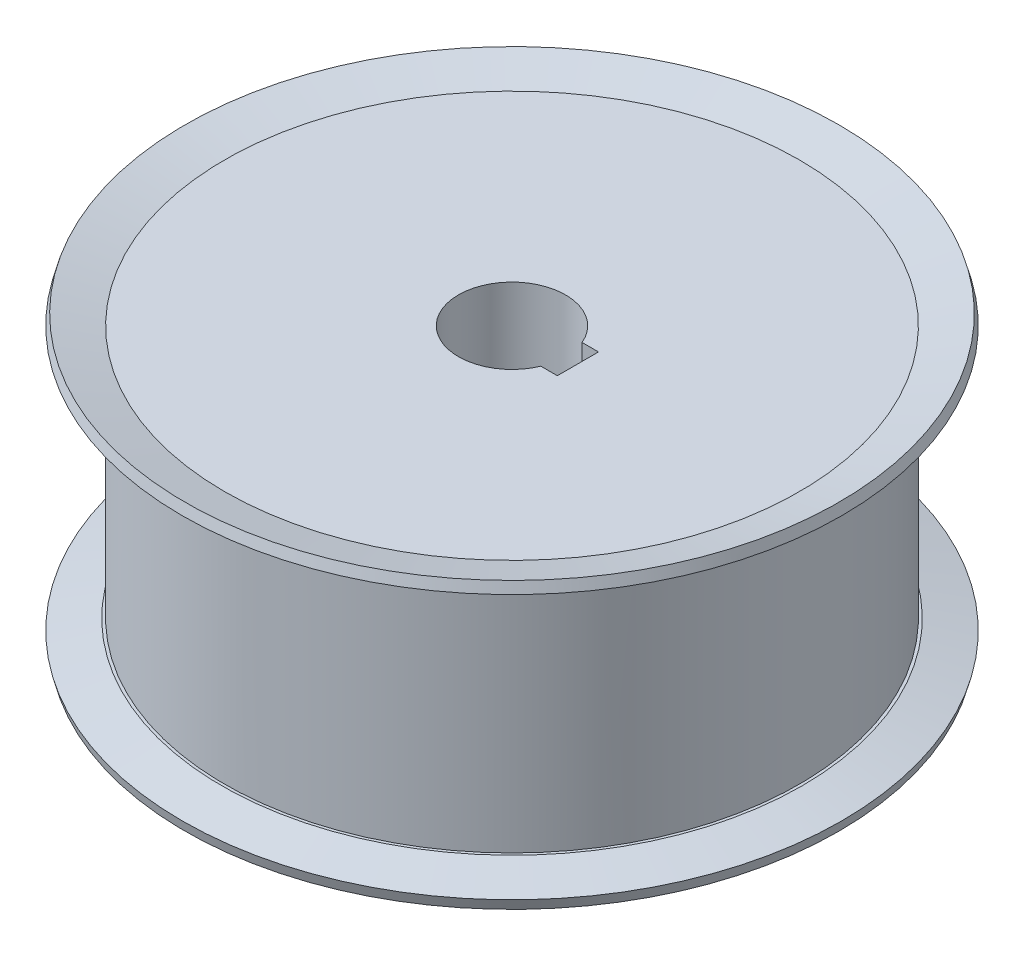
ISO-10303-21;
HEADER;
FILE_DESCRIPTION(('STEP AP214'),'2;1');
FILE_NAME('part.step','',(''),(''),'','','');
FILE_SCHEMA(('AUTOMOTIVE_DESIGN { 1 0 10303 214 1 1 1 1 }'));
ENDSEC;
DATA;
#1=APPLICATION_CONTEXT('core data for automotive mechanical design processes');
#2=APPLICATION_PROTOCOL_DEFINITION('international standard','automotive_design',2000,#1);
#3=PRODUCT_CONTEXT('',#1,'mechanical');
#4=PRODUCT('Part','Part','',(#3));
#5=PRODUCT_RELATED_PRODUCT_CATEGORY('part','',(#4));
#6=PRODUCT_DEFINITION_FORMATION('','',#4);
#7=PRODUCT_DEFINITION_CONTEXT('part definition',#1,'design');
#8=PRODUCT_DEFINITION('design','',#6,#7);
#9=PRODUCT_DEFINITION_SHAPE('','',#8);
#10=(LENGTH_UNIT() NAMED_UNIT(*) SI_UNIT(.MILLI.,.METRE.));
#11=(NAMED_UNIT(*) PLANE_ANGLE_UNIT() SI_UNIT($,.RADIAN.));
#12=(NAMED_UNIT(*) SI_UNIT($,.STERADIAN.) SOLID_ANGLE_UNIT());
#13=UNCERTAINTY_MEASURE_WITH_UNIT(LENGTH_MEASURE(1.E-05),#10,'distance_accuracy_value','');
#14=(GEOMETRIC_REPRESENTATION_CONTEXT(3) GLOBAL_UNCERTAINTY_ASSIGNED_CONTEXT((#13)) GLOBAL_UNIT_ASSIGNED_CONTEXT((#10,
#11,#12)) REPRESENTATION_CONTEXT('',''));
#15=CARTESIAN_POINT('',(0.,0.,0.));
#16=DIRECTION('',(0.,0.,1.));
#17=DIRECTION('',(1.,0.,0.));
#18=AXIS2_PLACEMENT_3D('',#15,#16,#17);
#19=CARTESIAN_POINT('',(0.,12.8,0.));
#20=DIRECTION('',(0.,-1.,0.));
#21=DIRECTION('',(0.,0.,-1.));
#22=AXIS2_PLACEMENT_3D('',#19,#20,#21);
#23=CYLINDRICAL_SURFACE('',#22,13.95);
#24=CARTESIAN_POINT('',(0.,0.499999999999957,0.));
#25=DIRECTION('',(0.,1.,0.));
#26=DIRECTION('',(-1.,0.,0.));
#27=AXIS2_PLACEMENT_3D('',#24,#25,#26);
#28=CIRCLE('',#27,13.95);
#29=CARTESIAN_POINT('',(-13.95,0.499999999999909,0.));
#30=VERTEX_POINT('',#29);
#31=EDGE_CURVE('E46',#30,#30,#28,.T.);
#32=ORIENTED_EDGE('',*,*,#31,.T.);
#33=EDGE_LOOP('',(#32));
#34=FACE_BOUND('',#33,.T.);
#35=CARTESIAN_POINT('',(0.,12.3,0.));
#36=DIRECTION('',(0.,-1.,0.));
#37=DIRECTION('',(0.,0.,-1.));
#38=AXIS2_PLACEMENT_3D('',#35,#36,#37);
#39=CIRCLE('',#38,13.95);
#40=CARTESIAN_POINT('',(0.,12.3,-13.95));
#41=VERTEX_POINT('',#40);
#42=EDGE_CURVE('E132',#41,#41,#39,.T.);
#43=ORIENTED_EDGE('',*,*,#42,.T.);
#44=EDGE_LOOP('',(#43));
#45=FACE_BOUND('',#44,.T.);
#46=ADVANCED_FACE('F43',(#34,#45),#23,.T.);
#47=CARTESIAN_POINT('',(0.,12.8,0.));
#48=DIRECTION('',(0.,1.,0.));
#49=DIRECTION('',(0.,0.,1.));
#50=AXIS2_PLACEMENT_3D('',#47,#48,#49);
#51=PLANE('',#50);
#52=CARTESIAN_POINT('',(0.,12.8,0.));
#53=DIRECTION('',(0.,1.,0.));
#54=DIRECTION('',(0.,0.,1.));
#55=AXIS2_PLACEMENT_3D('',#52,#53,#54);
#56=CIRCLE('',#55,2.6);
#57=CARTESIAN_POINT('',(2.4,12.8,-1.));
#58=VERTEX_POINT('',#57);
#59=CARTESIAN_POINT('',(2.4,12.8,1.));
#60=VERTEX_POINT('',#59);
#61=EDGE_CURVE('E60',#58,#60,#56,.T.);
#62=ORIENTED_EDGE('',*,*,#61,.F.);
#63=DIRECTION('',(-1.,0.,0.));
#64=VECTOR('',#63,1.);
#65=CARTESIAN_POINT('',(2.4,12.8,-1.));
#66=LINE('',#65,#64);
#67=CARTESIAN_POINT('',(3.2,12.8,-1.));
#68=VERTEX_POINT('',#67);
#69=EDGE_CURVE('E107',#68,#58,#66,.T.);
#70=ORIENTED_EDGE('',*,*,#69,.F.);
#71=DIRECTION('',(0.,0.,-1.));
#72=VECTOR('',#71,1.);
#73=CARTESIAN_POINT('',(3.2,12.8,-1.));
#74=LINE('',#73,#72);
#75=CARTESIAN_POINT('',(3.2,12.8,1.));
#76=VERTEX_POINT('',#75);
#77=EDGE_CURVE('E89',#76,#68,#74,.T.);
#78=ORIENTED_EDGE('',*,*,#77,.F.);
#79=DIRECTION('',(1.,0.,0.));
#80=VECTOR('',#79,1.);
#81=CARTESIAN_POINT('',(2.4,12.8,1.));
#82=LINE('',#81,#80);
#83=EDGE_CURVE('E99',#60,#76,#82,.T.);
#84=ORIENTED_EDGE('',*,*,#83,.F.);
#85=EDGE_LOOP('',(#62,#70,#78,#84));
#86=FACE_BOUND('',#85,.T.);
#87=CARTESIAN_POINT('',(0.,12.8,0.));
#88=DIRECTION('',(0.,-1.,0.));
#89=DIRECTION('',(0.,0.,-1.));
#90=AXIS2_PLACEMENT_3D('',#87,#88,#89);
#91=CIRCLE('',#90,13.95);
#92=CARTESIAN_POINT('',(0.,12.8,-13.95));
#93=VERTEX_POINT('',#92);
#94=EDGE_CURVE('E135',#93,#93,#91,.T.);
#95=ORIENTED_EDGE('',*,*,#94,.F.);
#96=EDGE_LOOP('',(#95));
#97=FACE_BOUND('',#96,.T.);
#98=ADVANCED_FACE('F104',(#86,#97),#51,.T.);
#99=CARTESIAN_POINT('',(0.,0.,0.));
#100=DIRECTION('',(0.,1.,0.));
#101=DIRECTION('',(0.,0.,1.));
#102=AXIS2_PLACEMENT_3D('',#99,#100,#101);
#103=PLANE('',#102);
#104=DIRECTION('',(-1.,0.,0.));
#105=VECTOR('',#104,1.);
#106=CARTESIAN_POINT('',(0.,0.,-1.));
#107=LINE('',#106,#105);
#108=CARTESIAN_POINT('',(3.2,0.,-1.));
#109=VERTEX_POINT('',#108);
#110=CARTESIAN_POINT('',(2.4,0.,-1.));
#111=VERTEX_POINT('',#110);
#112=EDGE_CURVE('E52',#109,#111,#107,.T.);
#113=ORIENTED_EDGE('',*,*,#112,.T.);
#114=CARTESIAN_POINT('',(0.,0.,0.));
#115=DIRECTION('',(0.,1.,0.));
#116=DIRECTION('',(0.,0.,1.));
#117=AXIS2_PLACEMENT_3D('',#114,#115,#116);
#118=CIRCLE('',#117,2.6);
#119=CARTESIAN_POINT('',(2.4,0.,1.));
#120=VERTEX_POINT('',#119);
#121=EDGE_CURVE('E11',#111,#120,#118,.T.);
#122=ORIENTED_EDGE('',*,*,#121,.T.);
#123=DIRECTION('',(1.,0.,0.));
#124=VECTOR('',#123,1.);
#125=CARTESIAN_POINT('',(0.,0.,1.));
#126=LINE('',#125,#124);
#127=CARTESIAN_POINT('',(3.2,0.,1.));
#128=VERTEX_POINT('',#127);
#129=EDGE_CURVE('E125',#120,#128,#126,.T.);
#130=ORIENTED_EDGE('',*,*,#129,.T.);
#131=DIRECTION('',(0.,0.,-1.));
#132=VECTOR('',#131,1.);
#133=CARTESIAN_POINT('',(3.2,0.,0.));
#134=LINE('',#133,#132);
#135=EDGE_CURVE('E92',#128,#109,#134,.T.);
#136=ORIENTED_EDGE('',*,*,#135,.T.);
#137=EDGE_LOOP('',(#113,#122,#130,#136));
#138=FACE_BOUND('',#137,.T.);
#139=CARTESIAN_POINT('',(0.,0.,0.));
#140=DIRECTION('',(0.,1.,0.));
#141=DIRECTION('',(0.,0.,1.));
#142=AXIS2_PLACEMENT_3D('',#139,#140,#141);
#143=CIRCLE('',#142,13.95);
#144=CARTESIAN_POINT('',(0.,0.,13.95));
#145=VERTEX_POINT('',#144);
#146=EDGE_CURVE('E117',#145,#145,#143,.T.);
#147=ORIENTED_EDGE('',*,*,#146,.F.);
#148=EDGE_LOOP('',(#147));
#149=FACE_BOUND('',#148,.T.);
#150=ADVANCED_FACE('F195',(#138,#149),#103,.F.);
#151=CARTESIAN_POINT('',(0.,-7.2,0.));
#152=DIRECTION('',(0.,1.,0.));
#153=DIRECTION('',(0.,0.,1.));
#154=AXIS2_PLACEMENT_3D('',#151,#152,#153);
#155=CYLINDRICAL_SURFACE('',#154,2.6);
#156=DIRECTION('',(0.,1.,0.));
#157=VECTOR('',#156,1.);
#158=CARTESIAN_POINT('',(2.4,-7.2,-1.));
#159=LINE('',#158,#157);
#160=EDGE_CURVE('E114',#111,#58,#159,.T.);
#161=ORIENTED_EDGE('',*,*,#160,.T.);
#162=ORIENTED_EDGE('',*,*,#61,.T.);
#163=DIRECTION('',(0.,1.,0.));
#164=VECTOR('',#163,1.);
#165=CARTESIAN_POINT('',(2.4,-7.2,1.));
#166=LINE('',#165,#164);
#167=EDGE_CURVE('E96',#120,#60,#166,.T.);
#168=ORIENTED_EDGE('',*,*,#167,.F.);
#169=ORIENTED_EDGE('',*,*,#121,.F.);
#170=EDGE_LOOP('',(#161,#162,#168,#169));
#171=FACE_BOUND('',#170,.T.);
#172=ADVANCED_FACE('F202',(#171),#155,.F.);
#173=CARTESIAN_POINT('',(2.4,-7.2,-1.));
#174=DIRECTION('',(0.,0.,-1.));
#175=DIRECTION('',(-1.,0.,0.));
#176=AXIS2_PLACEMENT_3D('',#173,#174,#175);
#177=PLANE('',#176);
#178=DIRECTION('',(0.,1.,0.));
#179=VECTOR('',#178,1.);
#180=CARTESIAN_POINT('',(3.2,-7.2,-1.));
#181=LINE('',#180,#179);
#182=EDGE_CURVE('E95',#109,#68,#181,.T.);
#183=ORIENTED_EDGE('',*,*,#182,.T.);
#184=ORIENTED_EDGE('',*,*,#69,.T.);
#185=ORIENTED_EDGE('',*,*,#160,.F.);
#186=ORIENTED_EDGE('',*,*,#112,.F.);
#187=EDGE_LOOP('',(#183,#184,#185,#186));
#188=FACE_BOUND('',#187,.T.);
#189=ADVANCED_FACE('F207',(#188),#177,.F.);
#190=CARTESIAN_POINT('',(3.2,-7.2,-1.));
#191=DIRECTION('',(1.,0.,0.));
#192=DIRECTION('',(0.,0.,-1.));
#193=AXIS2_PLACEMENT_3D('',#190,#191,#192);
#194=PLANE('',#193);
#195=DIRECTION('',(0.,1.,0.));
#196=VECTOR('',#195,1.);
#197=CARTESIAN_POINT('',(3.2,-7.2,1.));
#198=LINE('',#197,#196);
#199=EDGE_CURVE('E68',#128,#76,#198,.T.);
#200=ORIENTED_EDGE('',*,*,#199,.T.);
#201=ORIENTED_EDGE('',*,*,#77,.T.);
#202=ORIENTED_EDGE('',*,*,#182,.F.);
#203=ORIENTED_EDGE('',*,*,#135,.F.);
#204=EDGE_LOOP('',(#200,#201,#202,#203));
#205=FACE_BOUND('',#204,.T.);
#206=ADVANCED_FACE('F86',(#205),#194,.F.);
#207=CARTESIAN_POINT('',(2.4,-7.2,1.));
#208=DIRECTION('',(0.,0.,1.));
#209=DIRECTION('',(1.,0.,0.));
#210=AXIS2_PLACEMENT_3D('',#207,#208,#209);
#211=PLANE('',#210);
#212=ORIENTED_EDGE('',*,*,#167,.T.);
#213=ORIENTED_EDGE('',*,*,#83,.T.);
#214=ORIENTED_EDGE('',*,*,#199,.F.);
#215=ORIENTED_EDGE('',*,*,#129,.F.);
#216=EDGE_LOOP('',(#212,#213,#214,#215));
#217=FACE_BOUND('',#216,.T.);
#218=ADVANCED_FACE('F100',(#217),#211,.F.);
#219=CARTESIAN_POINT('',(14.0839745962156,12.3,0.));
#220=DIRECTION('',(0.,-1.,0.));
#221=DIRECTION('',(0.,0.,-1.));
#222=AXIS2_PLACEMENT_3D('',#219,#220,#221);
#223=PLANE('',#222);
#224=ORIENTED_EDGE('',*,*,#42,.F.);
#225=EDGE_LOOP('',(#224));
#226=FACE_BOUND('',#225,.T.);
#227=CARTESIAN_POINT('',(0.,12.3,0.));
#228=DIRECTION('',(0.,-1.,0.));
#229=DIRECTION('',(0.,0.,-1.));
#230=AXIS2_PLACEMENT_3D('',#227,#228,#229);
#231=CIRCLE('',#230,14.0839745962156);
#232=CARTESIAN_POINT('',(0.,12.3,-14.0839745962156));
#233=VERTEX_POINT('',#232);
#234=EDGE_CURVE('E153',#233,#233,#231,.T.);
#235=ORIENTED_EDGE('',*,*,#234,.T.);
#236=EDGE_LOOP('',(#235));
#237=FACE_BOUND('',#236,.T.);
#238=ADVANCED_FACE('F210',(#226,#237),#223,.T.);
#239=CARTESIAN_POINT('',(0.,13.3147372055837,0.));
#240=DIRECTION('',(0.,1.,0.));
#241=DIRECTION('',(0.,0.,1.));
#242=AXIS2_PLACEMENT_3D('',#239,#240,#241);
#243=CONICAL_SURFACE('',#242,15.8710254037844,1.30899693899574);
#244=ORIENTED_EDGE('',*,*,#94,.T.);
#245=EDGE_LOOP('',(#244));
#246=FACE_BOUND('',#245,.T.);
#247=CARTESIAN_POINT('',(0.,13.3147372055837,0.));
#248=DIRECTION('',(0.,-1.,0.));
#249=DIRECTION('',(0.,0.,-1.));
#250=AXIS2_PLACEMENT_3D('',#247,#248,#249);
#251=CIRCLE('',#250,15.8710254037844);
#252=CARTESIAN_POINT('',(0.,13.3147372055837,-15.8710254037844));
#253=VERTEX_POINT('',#252);
#254=EDGE_CURVE('E141',#253,#253,#251,.T.);
#255=ORIENTED_EDGE('',*,*,#254,.F.);
#256=EDGE_LOOP('',(#255));
#257=FACE_BOUND('',#256,.T.);
#258=ADVANCED_FACE('F218',(#246,#257),#243,.F.);
#259=CARTESIAN_POINT('',(0.,12.8147372055837,0.));
#260=DIRECTION('',(0.,-1.,0.));
#261=DIRECTION('',(0.,0.,-1.));
#262=AXIS2_PLACEMENT_3D('',#259,#260,#261);
#263=CONICAL_SURFACE('',#262,16.005,0.261799387799153);
#264=ORIENTED_EDGE('',*,*,#254,.T.);
#265=EDGE_LOOP('',(#264));
#266=FACE_BOUND('',#265,.T.);
#267=CARTESIAN_POINT('',(0.,12.8147372055837,0.));
#268=DIRECTION('',(0.,-1.,0.));
#269=DIRECTION('',(0.,0.,-1.));
#270=AXIS2_PLACEMENT_3D('',#267,#268,#269);
#271=CIRCLE('',#270,16.005);
#272=CARTESIAN_POINT('',(0.,12.8147372055837,-16.005));
#273=VERTEX_POINT('',#272);
#274=EDGE_CURVE('E147',#273,#273,#271,.T.);
#275=ORIENTED_EDGE('',*,*,#274,.F.);
#276=EDGE_LOOP('',(#275));
#277=FACE_BOUND('',#276,.T.);
#278=ADVANCED_FACE('F186',(#266,#277),#263,.T.);
#279=CARTESIAN_POINT('',(0.,12.3,0.));
#280=DIRECTION('',(0.,1.,0.));
#281=DIRECTION('',(0.,0.,1.));
#282=AXIS2_PLACEMENT_3D('',#279,#280,#281);
#283=CONICAL_SURFACE('',#282,14.0839745962156,1.30899693899575);
#284=ORIENTED_EDGE('',*,*,#274,.T.);
#285=EDGE_LOOP('',(#284));
#286=FACE_BOUND('',#285,.T.);
#287=ORIENTED_EDGE('',*,*,#234,.F.);
#288=EDGE_LOOP('',(#287));
#289=FACE_BOUND('',#288,.T.);
#290=ADVANCED_FACE('F176',(#286,#289),#283,.T.);
#291=CARTESIAN_POINT('',(14.0839745962156,0.500000000000006,0.));
#292=DIRECTION('',(0.,1.,0.));
#293=DIRECTION('',(-1.,0.,0.));
#294=AXIS2_PLACEMENT_3D('',#291,#292,#293);
#295=PLANE('',#294);
#296=ORIENTED_EDGE('',*,*,#31,.F.);
#297=EDGE_LOOP('',(#296));
#298=FACE_BOUND('',#297,.T.);
#299=CARTESIAN_POINT('',(0.,0.499999999999954,0.));
#300=DIRECTION('',(0.,-1.,0.));
#301=DIRECTION('',(1.,0.,0.));
#302=AXIS2_PLACEMENT_3D('',#299,#300,#301);
#303=CIRCLE('',#302,14.0839745962156);
#304=CARTESIAN_POINT('',(14.0839745962156,0.500000000000002,0.));
#305=VERTEX_POINT('',#304);
#306=EDGE_CURVE('E165',#305,#305,#303,.T.);
#307=ORIENTED_EDGE('',*,*,#306,.F.);
#308=EDGE_LOOP('',(#307));
#309=FACE_BOUND('',#308,.T.);
#310=ADVANCED_FACE('F173',(#298,#309),#295,.T.);
#311=CARTESIAN_POINT('',(0.,0.,0.));
#312=DIRECTION('',(0.,-1.,0.));
#313=DIRECTION('',(1.,0.,0.));
#314=AXIS2_PLACEMENT_3D('',#311,#312,#313);
#315=CONICAL_SURFACE('',#314,13.95,1.30899693899574);
#316=CARTESIAN_POINT('',(0.,-0.514737205583772,0.));
#317=DIRECTION('',(0.,-1.,0.));
#318=DIRECTION('',(1.,0.,0.));
#319=AXIS2_PLACEMENT_3D('',#316,#317,#318);
#320=CIRCLE('',#319,15.8710254037844);
#321=CARTESIAN_POINT('',(15.8710254037844,-0.514737205583718,0.));
#322=VERTEX_POINT('',#321);
#323=EDGE_CURVE('E157',#322,#322,#320,.T.);
#324=ORIENTED_EDGE('',*,*,#323,.T.);
#325=EDGE_LOOP('',(#324));
#326=FACE_BOUND('',#325,.T.);
#327=ORIENTED_EDGE('',*,*,#146,.T.);
#328=EDGE_LOOP('',(#327));
#329=FACE_BOUND('',#328,.T.);
#330=ADVANCED_FACE('F175',(#326,#329),#315,.F.);
#331=CARTESIAN_POINT('',(0.,-0.514737205583772,0.));
#332=DIRECTION('',(0.,1.,0.));
#333=DIRECTION('',(-1.,0.,0.));
#334=AXIS2_PLACEMENT_3D('',#331,#332,#333);
#335=CONICAL_SURFACE('',#334,15.8710254037844,0.261799387799158);
#336=CARTESIAN_POINT('',(0.,-0.0147372055837636,0.));
#337=DIRECTION('',(0.,-1.,0.));
#338=DIRECTION('',(1.,0.,0.));
#339=AXIS2_PLACEMENT_3D('',#336,#337,#338);
#340=CIRCLE('',#339,16.005);
#341=CARTESIAN_POINT('',(16.005,-0.0147372055837087,0.));
#342=VERTEX_POINT('',#341);
#343=EDGE_CURVE('E161',#342,#342,#340,.T.);
#344=ORIENTED_EDGE('',*,*,#343,.T.);
#345=EDGE_LOOP('',(#344));
#346=FACE_BOUND('',#345,.T.);
#347=ORIENTED_EDGE('',*,*,#323,.F.);
#348=EDGE_LOOP('',(#347));
#349=FACE_BOUND('',#348,.T.);
#350=ADVANCED_FACE('F183',(#346,#349),#335,.T.);
#351=CARTESIAN_POINT('',(0.,-0.0147372055837636,0.));
#352=DIRECTION('',(0.,-1.,0.));
#353=DIRECTION('',(1.,0.,0.));
#354=AXIS2_PLACEMENT_3D('',#351,#352,#353);
#355=CONICAL_SURFACE('',#354,16.005,1.30899693899574);
#356=ORIENTED_EDGE('',*,*,#306,.T.);
#357=EDGE_LOOP('',(#356));
#358=FACE_BOUND('',#357,.T.);
#359=ORIENTED_EDGE('',*,*,#343,.F.);
#360=EDGE_LOOP('',(#359));
#361=FACE_BOUND('',#360,.T.);
#362=ADVANCED_FACE('F170',(#358,#361),#355,.T.);
#363=CLOSED_SHELL('',(#46,#98,#150,#172,#189,#206,#218,#238,#258,#278,#290,#310,#330,#350,#362));
#364=MANIFOLD_SOLID_BREP('B2',#363);
#365=ADVANCED_BREP_SHAPE_REPRESENTATION('',(#18,#364),#14);
#366=SHAPE_DEFINITION_REPRESENTATION(#9,#365);
ENDSEC;
END-ISO-10303-21;
